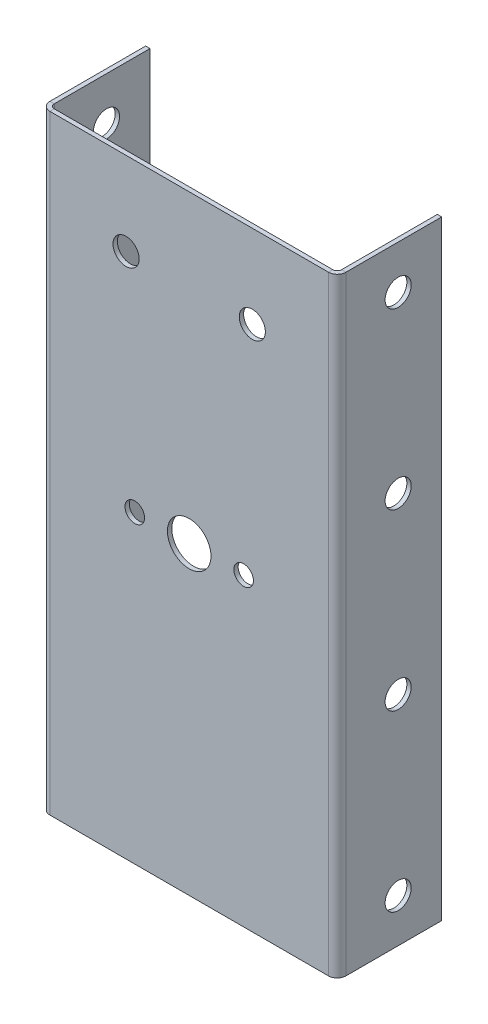
ISO-10303-21;
HEADER;
FILE_DESCRIPTION(('STEP AP214'),'2;1');
FILE_NAME('part.step','',(''),(''),'','','');
FILE_SCHEMA(('AUTOMOTIVE_DESIGN { 1 0 10303 214 1 1 1 1 }'));
ENDSEC;
DATA;
#1=APPLICATION_CONTEXT('core data for automotive mechanical design processes');
#2=APPLICATION_PROTOCOL_DEFINITION('international standard','automotive_design',2000,#1);
#3=PRODUCT_CONTEXT('',#1,'mechanical');
#4=PRODUCT('Part','Part','',(#3));
#5=PRODUCT_RELATED_PRODUCT_CATEGORY('part','',(#4));
#6=PRODUCT_DEFINITION_FORMATION('','',#4);
#7=PRODUCT_DEFINITION_CONTEXT('part definition',#1,'design');
#8=PRODUCT_DEFINITION('design','',#6,#7);
#9=PRODUCT_DEFINITION_SHAPE('','',#8);
#10=(LENGTH_UNIT() NAMED_UNIT(*) SI_UNIT(.MILLI.,.METRE.));
#11=(NAMED_UNIT(*) PLANE_ANGLE_UNIT() SI_UNIT($,.RADIAN.));
#12=(NAMED_UNIT(*) SI_UNIT($,.STERADIAN.) SOLID_ANGLE_UNIT());
#13=UNCERTAINTY_MEASURE_WITH_UNIT(LENGTH_MEASURE(1.E-05),#10,'distance_accuracy_value','');
#14=(GEOMETRIC_REPRESENTATION_CONTEXT(3) GLOBAL_UNCERTAINTY_ASSIGNED_CONTEXT((#13)) GLOBAL_UNIT_ASSIGNED_CONTEXT((#10,
#11,#12)) REPRESENTATION_CONTEXT('',''));
#15=CARTESIAN_POINT('',(0.,0.,0.));
#16=DIRECTION('',(0.,0.,1.));
#17=DIRECTION('',(1.,0.,0.));
#18=AXIS2_PLACEMENT_3D('',#15,#16,#17);
#19=CARTESIAN_POINT('',(-12.180744500846,70.,-1.));
#20=DIRECTION('',(0.,1.,0.));
#21=DIRECTION('',(0.,0.,1.));
#22=AXIS2_PLACEMENT_3D('',#19,#20,#21);
#23=PLANE('',#22);
#24=DIRECTION('',(1.,0.,0.));
#25=VECTOR('',#24,1.);
#26=CARTESIAN_POINT('',(-12.180744500846,70.,-1.));
#27=LINE('',#26,#25);
#28=CARTESIAN_POINT('',(-12.180744500846,70.,-1.));
#29=VERTEX_POINT('',#28);
#30=CARTESIAN_POINT('',(-11.680744500846,70.,-1.));
#31=VERTEX_POINT('',#30);
#32=EDGE_CURVE('E13',#29,#31,#27,.T.);
#33=ORIENTED_EDGE('',*,*,#32,.F.);
#34=CARTESIAN_POINT('',(-11.180744500846,70.,-1.));
#35=DIRECTION('',(0.,-1.,0.));
#36=DIRECTION('',(0.,0.,-1.));
#37=AXIS2_PLACEMENT_3D('',#34,#35,#36);
#38=CIRCLE('',#37,1.);
#39=CARTESIAN_POINT('',(-11.180744500846,70.,0.));
#40=VERTEX_POINT('',#39);
#41=EDGE_CURVE('E156',#29,#40,#38,.F.);
#42=ORIENTED_EDGE('',*,*,#41,.T.);
#43=DIRECTION('',(0.,0.,1.));
#44=VECTOR('',#43,1.);
#45=CARTESIAN_POINT('',(-11.180744500846,70.,-0.5));
#46=LINE('',#45,#44);
#47=CARTESIAN_POINT('',(-11.180744500846,70.,-0.5));
#48=VERTEX_POINT('',#47);
#49=EDGE_CURVE('E54',#48,#40,#46,.T.);
#50=ORIENTED_EDGE('',*,*,#49,.F.);
#51=CARTESIAN_POINT('',(-11.180744500846,70.,-1.));
#52=DIRECTION('',(0.,1.,0.));
#53=DIRECTION('',(1.,0.,0.));
#54=AXIS2_PLACEMENT_3D('',#51,#52,#53);
#55=CIRCLE('',#54,0.5);
#56=EDGE_CURVE('E251',#31,#48,#55,.T.);
#57=ORIENTED_EDGE('',*,*,#56,.F.);
#58=EDGE_LOOP('',(#33,#42,#50,#57));
#59=FACE_BOUND('',#58,.T.);
#60=ADVANCED_FACE('F46',(#59),#23,.T.);
#61=CARTESIAN_POINT('',(-11.180744500846,70.,-0.5));
#62=DIRECTION('',(0.,1.,0.));
#63=DIRECTION('',(0.,0.,1.));
#64=AXIS2_PLACEMENT_3D('',#61,#62,#63);
#65=PLANE('',#64);
#66=DIRECTION('',(0.,0.,1.));
#67=VECTOR('',#66,1.);
#68=CARTESIAN_POINT('',(-12.180744500846,70.,-12.));
#69=LINE('',#68,#67);
#70=CARTESIAN_POINT('',(-12.180744500846,70.,-12.));
#71=VERTEX_POINT('',#70);
#72=EDGE_CURVE('E161',#71,#29,#69,.T.);
#73=ORIENTED_EDGE('',*,*,#72,.T.);
#74=ORIENTED_EDGE('',*,*,#32,.T.);
#75=DIRECTION('',(0.,0.,1.));
#76=VECTOR('',#75,1.);
#77=CARTESIAN_POINT('',(-11.680744500846,70.,-12.));
#78=LINE('',#77,#76);
#79=CARTESIAN_POINT('',(-11.680744500846,70.,-12.));
#80=VERTEX_POINT('',#79);
#81=EDGE_CURVE('E264',#80,#31,#78,.T.);
#82=ORIENTED_EDGE('',*,*,#81,.F.);
#83=DIRECTION('',(1.,0.,0.));
#84=VECTOR('',#83,1.);
#85=CARTESIAN_POINT('',(-12.180744500846,70.,-12.));
#86=LINE('',#85,#84);
#87=EDGE_CURVE('E266',#71,#80,#86,.T.);
#88=ORIENTED_EDGE('',*,*,#87,.F.);
#89=EDGE_LOOP('',(#73,#74,#82,#88));
#90=FACE_BOUND('',#89,.T.);
#91=ADVANCED_FACE('F277',(#90),#65,.T.);
#92=CARTESIAN_POINT('',(-11.180744500846,0.,0.));
#93=DIRECTION('',(0.,-1.,0.));
#94=DIRECTION('',(0.,0.,-1.));
#95=AXIS2_PLACEMENT_3D('',#92,#93,#94);
#96=PLANE('',#95);
#97=DIRECTION('',(0.,0.,-1.));
#98=VECTOR('',#97,1.);
#99=CARTESIAN_POINT('',(-11.180744500846,0.,0.));
#100=LINE('',#99,#98);
#101=CARTESIAN_POINT('',(-11.180744500846,0.,0.));
#102=VERTEX_POINT('',#101);
#103=CARTESIAN_POINT('',(-11.180744500846,0.,-0.5));
#104=VERTEX_POINT('',#103);
#105=EDGE_CURVE('E154',#102,#104,#100,.T.);
#106=ORIENTED_EDGE('',*,*,#105,.F.);
#107=CARTESIAN_POINT('',(-11.180744500846,0.,-1.));
#108=DIRECTION('',(0.,-1.,0.));
#109=DIRECTION('',(0.,0.,-1.));
#110=AXIS2_PLACEMENT_3D('',#107,#108,#109);
#111=CIRCLE('',#110,1.);
#112=CARTESIAN_POINT('',(-12.180744500846,0.,-1.));
#113=VERTEX_POINT('',#112);
#114=EDGE_CURVE('E168',#113,#102,#111,.F.);
#115=ORIENTED_EDGE('',*,*,#114,.F.);
#116=DIRECTION('',(-1.,0.,0.));
#117=VECTOR('',#116,1.);
#118=CARTESIAN_POINT('',(-11.680744500846,0.,-1.));
#119=LINE('',#118,#117);
#120=CARTESIAN_POINT('',(-11.680744500846,0.,-1.));
#121=VERTEX_POINT('',#120);
#122=EDGE_CURVE('E242',#121,#113,#119,.T.);
#123=ORIENTED_EDGE('',*,*,#122,.F.);
#124=CARTESIAN_POINT('',(-11.180744500846,0.,-1.));
#125=DIRECTION('',(0.,1.,0.));
#126=DIRECTION('',(1.,0.,0.));
#127=AXIS2_PLACEMENT_3D('',#124,#125,#126);
#128=CIRCLE('',#127,0.5);
#129=EDGE_CURVE('E196',#121,#104,#128,.T.);
#130=ORIENTED_EDGE('',*,*,#129,.T.);
#131=EDGE_LOOP('',(#106,#115,#123,#130));
#132=FACE_BOUND('',#131,.T.);
#133=ADVANCED_FACE('F256',(#132),#96,.T.);
#134=CARTESIAN_POINT('',(-11.680744500846,0.,-1.));
#135=DIRECTION('',(0.,-1.,0.));
#136=DIRECTION('',(0.,0.,-1.));
#137=AXIS2_PLACEMENT_3D('',#134,#135,#136);
#138=PLANE('',#137);
#139=DIRECTION('',(1.,0.,0.));
#140=VECTOR('',#139,1.);
#141=CARTESIAN_POINT('',(-12.180744500846,0.,0.));
#142=LINE('',#141,#140);
#143=CARTESIAN_POINT('',(20.819255499154,0.,0.));
#144=VERTEX_POINT('',#143);
#145=EDGE_CURVE('E209',#102,#144,#142,.T.);
#146=ORIENTED_EDGE('',*,*,#145,.F.);
#147=ORIENTED_EDGE('',*,*,#105,.T.);
#148=DIRECTION('',(1.,0.,0.));
#149=VECTOR('',#148,1.);
#150=CARTESIAN_POINT('',(-12.180744500846,0.,-0.5));
#151=LINE('',#150,#149);
#152=CARTESIAN_POINT('',(20.819255499154,0.,-0.500000000000002));
#153=VERTEX_POINT('',#152);
#154=EDGE_CURVE('E194',#104,#153,#151,.T.);
#155=ORIENTED_EDGE('',*,*,#154,.T.);
#156=DIRECTION('',(0.,0.,1.));
#157=VECTOR('',#156,1.);
#158=CARTESIAN_POINT('',(20.819255499154,0.,-0.500000000000002));
#159=LINE('',#158,#157);
#160=EDGE_CURVE('E103',#153,#144,#159,.T.);
#161=ORIENTED_EDGE('',*,*,#160,.T.);
#162=EDGE_LOOP('',(#146,#147,#155,#161));
#163=FACE_BOUND('',#162,.T.);
#164=ADVANCED_FACE('F244',(#163),#138,.T.);
#165=CARTESIAN_POINT('',(20.819255499154,70.,0.));
#166=DIRECTION('',(0.,1.,0.));
#167=DIRECTION('',(0.,0.,1.));
#168=AXIS2_PLACEMENT_3D('',#165,#166,#167);
#169=PLANE('',#168);
#170=DIRECTION('',(0.,0.,-1.));
#171=VECTOR('',#170,1.);
#172=CARTESIAN_POINT('',(20.819255499154,70.,0.));
#173=LINE('',#172,#171);
#174=CARTESIAN_POINT('',(20.819255499154,70.,0.));
#175=VERTEX_POINT('',#174);
#176=CARTESIAN_POINT('',(20.819255499154,70.,-0.500000000000002));
#177=VERTEX_POINT('',#176);
#178=EDGE_CURVE('E240',#175,#177,#173,.T.);
#179=ORIENTED_EDGE('',*,*,#178,.F.);
#180=CARTESIAN_POINT('',(20.819255499154,70.,-1.));
#181=DIRECTION('',(0.,-1.,0.));
#182=DIRECTION('',(0.,0.,-1.));
#183=AXIS2_PLACEMENT_3D('',#180,#181,#182);
#184=CIRCLE('',#183,1.);
#185=CARTESIAN_POINT('',(21.819255499154,70.,-1.));
#186=VERTEX_POINT('',#185);
#187=EDGE_CURVE('E176',#175,#186,#184,.F.);
#188=ORIENTED_EDGE('',*,*,#187,.T.);
#189=DIRECTION('',(1.,0.,0.));
#190=VECTOR('',#189,1.);
#191=CARTESIAN_POINT('',(21.319255499154,70.,-1.));
#192=LINE('',#191,#190);
#193=CARTESIAN_POINT('',(21.319255499154,70.,-1.));
#194=VERTEX_POINT('',#193);
#195=EDGE_CURVE('E62',#194,#186,#192,.T.);
#196=ORIENTED_EDGE('',*,*,#195,.F.);
#197=CARTESIAN_POINT('',(20.819255499154,70.,-1.));
#198=DIRECTION('',(0.,1.,0.));
#199=DIRECTION('',(1.,0.,0.));
#200=AXIS2_PLACEMENT_3D('',#197,#198,#199);
#201=CIRCLE('',#200,0.5);
#202=EDGE_CURVE('E268',#177,#194,#201,.T.);
#203=ORIENTED_EDGE('',*,*,#202,.F.);
#204=EDGE_LOOP('',(#179,#188,#196,#203));
#205=FACE_BOUND('',#204,.T.);
#206=ADVANCED_FACE('F305',(#205),#169,.T.);
#207=CARTESIAN_POINT('',(21.319255499154,70.,-1.));
#208=DIRECTION('',(0.,1.,0.));
#209=DIRECTION('',(0.,0.,1.));
#210=AXIS2_PLACEMENT_3D('',#207,#208,#209);
#211=PLANE('',#210);
#212=DIRECTION('',(1.,0.,0.));
#213=VECTOR('',#212,1.);
#214=CARTESIAN_POINT('',(-12.180744500846,70.,0.));
#215=LINE('',#214,#213);
#216=EDGE_CURVE('E146',#40,#175,#215,.T.);
#217=ORIENTED_EDGE('',*,*,#216,.T.);
#218=ORIENTED_EDGE('',*,*,#178,.T.);
#219=DIRECTION('',(1.,0.,0.));
#220=VECTOR('',#219,1.);
#221=CARTESIAN_POINT('',(-12.180744500846,70.,-0.5));
#222=LINE('',#221,#220);
#223=EDGE_CURVE('E149',#48,#177,#222,.T.);
#224=ORIENTED_EDGE('',*,*,#223,.F.);
#225=ORIENTED_EDGE('',*,*,#49,.T.);
#226=EDGE_LOOP('',(#217,#218,#224,#225));
#227=FACE_BOUND('',#226,.T.);
#228=ADVANCED_FACE('F144',(#227),#211,.T.);
#229=CARTESIAN_POINT('',(21.819255499154,0.,-1.));
#230=DIRECTION('',(0.,-1.,0.));
#231=DIRECTION('',(0.,0.,-1.));
#232=AXIS2_PLACEMENT_3D('',#229,#230,#231);
#233=PLANE('',#232);
#234=DIRECTION('',(-1.,0.,0.));
#235=VECTOR('',#234,1.);
#236=CARTESIAN_POINT('',(21.819255499154,0.,-1.));
#237=LINE('',#236,#235);
#238=CARTESIAN_POINT('',(21.819255499154,0.,-1.));
#239=VERTEX_POINT('',#238);
#240=CARTESIAN_POINT('',(21.319255499154,0.,-1.));
#241=VERTEX_POINT('',#240);
#242=EDGE_CURVE('E110',#239,#241,#237,.T.);
#243=ORIENTED_EDGE('',*,*,#242,.F.);
#244=CARTESIAN_POINT('',(20.819255499154,0.,-1.));
#245=DIRECTION('',(0.,-1.,0.));
#246=DIRECTION('',(0.,0.,-1.));
#247=AXIS2_PLACEMENT_3D('',#244,#245,#246);
#248=CIRCLE('',#247,1.);
#249=EDGE_CURVE('E211',#144,#239,#248,.F.);
#250=ORIENTED_EDGE('',*,*,#249,.F.);
#251=ORIENTED_EDGE('',*,*,#160,.F.);
#252=CARTESIAN_POINT('',(20.819255499154,0.,-1.));
#253=DIRECTION('',(0.,1.,0.));
#254=DIRECTION('',(1.,0.,0.));
#255=AXIS2_PLACEMENT_3D('',#252,#253,#254);
#256=CIRCLE('',#255,0.5);
#257=EDGE_CURVE('E192',#153,#241,#256,.T.);
#258=ORIENTED_EDGE('',*,*,#257,.T.);
#259=EDGE_LOOP('',(#243,#250,#251,#258));
#260=FACE_BOUND('',#259,.T.);
#261=ADVANCED_FACE('F311',(#260),#233,.T.);
#262=CARTESIAN_POINT('',(20.819255499154,0.,-0.500000000000002));
#263=DIRECTION('',(0.,-1.,0.));
#264=DIRECTION('',(0.,0.,-1.));
#265=AXIS2_PLACEMENT_3D('',#262,#263,#264);
#266=PLANE('',#265);
#267=DIRECTION('',(0.,0.,-1.));
#268=VECTOR('',#267,1.);
#269=CARTESIAN_POINT('',(21.819255499154,0.,0.));
#270=LINE('',#269,#268);
#271=CARTESIAN_POINT('',(21.819255499154,0.,-12.));
#272=VERTEX_POINT('',#271);
#273=EDGE_CURVE('E182',#239,#272,#270,.T.);
#274=ORIENTED_EDGE('',*,*,#273,.F.);
#275=ORIENTED_EDGE('',*,*,#242,.T.);
#276=DIRECTION('',(0.,0.,-1.));
#277=VECTOR('',#276,1.);
#278=CARTESIAN_POINT('',(21.319255499154,0.,0.));
#279=LINE('',#278,#277);
#280=CARTESIAN_POINT('',(21.319255499154,0.,-12.));
#281=VERTEX_POINT('',#280);
#282=EDGE_CURVE('E189',#241,#281,#279,.T.);
#283=ORIENTED_EDGE('',*,*,#282,.T.);
#284=DIRECTION('',(1.,0.,0.));
#285=VECTOR('',#284,1.);
#286=CARTESIAN_POINT('',(21.319255499154,0.,-12.));
#287=LINE('',#286,#285);
#288=EDGE_CURVE('E185',#281,#272,#287,.T.);
#289=ORIENTED_EDGE('',*,*,#288,.T.);
#290=EDGE_LOOP('',(#274,#275,#283,#289));
#291=FACE_BOUND('',#290,.T.);
#292=ADVANCED_FACE('F314',(#291),#266,.T.);
#293=CARTESIAN_POINT('',(21.819255499154,70.,0.));
#294=DIRECTION('',(-1.,0.,0.));
#295=DIRECTION('',(0.,0.,1.));
#296=AXIS2_PLACEMENT_3D('',#293,#294,#295);
#297=PLANE('',#296);
#298=CARTESIAN_POINT('',(21.819255499154,65.,-7.));
#299=DIRECTION('',(-1.,0.,0.));
#300=DIRECTION('',(0.,0.,-1.));
#301=AXIS2_PLACEMENT_3D('',#298,#299,#300);
#302=CIRCLE('',#301,1.5);
#303=CARTESIAN_POINT('',(21.819255499154,65.,-8.5));
#304=VERTEX_POINT('',#303);
#305=EDGE_CURVE('E772',#304,#304,#302,.T.);
#306=ORIENTED_EDGE('',*,*,#305,.T.);
#307=EDGE_LOOP('',(#306));
#308=FACE_BOUND('',#307,.T.);
#309=CARTESIAN_POINT('',(21.819255499154,45.,-7.));
#310=DIRECTION('',(-1.,0.,0.));
#311=DIRECTION('',(0.,0.,-1.));
#312=AXIS2_PLACEMENT_3D('',#309,#310,#311);
#313=CIRCLE('',#312,1.5);
#314=CARTESIAN_POINT('',(21.819255499154,45.,-8.5));
#315=VERTEX_POINT('',#314);
#316=EDGE_CURVE('E760',#315,#315,#313,.T.);
#317=ORIENTED_EDGE('',*,*,#316,.T.);
#318=EDGE_LOOP('',(#317));
#319=FACE_BOUND('',#318,.T.);
#320=CARTESIAN_POINT('',(21.819255499154,5.,-7.));
#321=DIRECTION('',(-1.,0.,0.));
#322=DIRECTION('',(0.,0.,1.));
#323=AXIS2_PLACEMENT_3D('',#320,#321,#322);
#324=CIRCLE('',#323,1.5);
#325=CARTESIAN_POINT('',(21.819255499154,5.,-5.5));
#326=VERTEX_POINT('',#325);
#327=EDGE_CURVE('E748',#326,#326,#324,.T.);
#328=ORIENTED_EDGE('',*,*,#327,.T.);
#329=EDGE_LOOP('',(#328));
#330=FACE_BOUND('',#329,.T.);
#331=CARTESIAN_POINT('',(21.819255499154,25.,-7.));
#332=DIRECTION('',(-1.,0.,0.));
#333=DIRECTION('',(0.,0.,1.));
#334=AXIS2_PLACEMENT_3D('',#331,#332,#333);
#335=CIRCLE('',#334,1.5);
#336=CARTESIAN_POINT('',(21.819255499154,25.,-5.5));
#337=VERTEX_POINT('',#336);
#338=EDGE_CURVE('E736',#337,#337,#335,.T.);
#339=ORIENTED_EDGE('',*,*,#338,.T.);
#340=EDGE_LOOP('',(#339));
#341=FACE_BOUND('',#340,.T.);
#342=ORIENTED_EDGE('',*,*,#273,.T.);
#343=DIRECTION('',(0.,-1.,0.));
#344=VECTOR('',#343,1.);
#345=CARTESIAN_POINT('',(21.819255499154,70.,-12.));
#346=LINE('',#345,#344);
#347=CARTESIAN_POINT('',(21.819255499154,70.,-12.));
#348=VERTEX_POINT('',#347);
#349=EDGE_CURVE('E235',#348,#272,#346,.T.);
#350=ORIENTED_EDGE('',*,*,#349,.F.);
#351=DIRECTION('',(0.,0.,-1.));
#352=VECTOR('',#351,1.);
#353=CARTESIAN_POINT('',(21.819255499154,70.,0.));
#354=LINE('',#353,#352);
#355=EDGE_CURVE('E116',#186,#348,#354,.T.);
#356=ORIENTED_EDGE('',*,*,#355,.F.);
#357=DIRECTION('',(0.,-1.,0.));
#358=VECTOR('',#357,1.);
#359=CARTESIAN_POINT('',(21.819255499154,70.,-1.));
#360=LINE('',#359,#358);
#361=EDGE_CURVE('E178',#186,#239,#360,.T.);
#362=ORIENTED_EDGE('',*,*,#361,.T.);
#363=EDGE_LOOP('',(#342,#350,#356,#362));
#364=FACE_BOUND('',#363,.T.);
#365=ADVANCED_FACE('F317',(#308,#319,#330,#341,#364),#297,.F.);
#366=CARTESIAN_POINT('',(21.319255499154,70.,-12.));
#367=DIRECTION('',(0.,0.,-1.));
#368=DIRECTION('',(-1.,0.,0.));
#369=AXIS2_PLACEMENT_3D('',#366,#367,#368);
#370=PLANE('',#369);
#371=ORIENTED_EDGE('',*,*,#288,.F.);
#372=DIRECTION('',(0.,-1.,0.));
#373=VECTOR('',#372,1.);
#374=CARTESIAN_POINT('',(21.319255499154,70.,-12.));
#375=LINE('',#374,#373);
#376=CARTESIAN_POINT('',(21.319255499154,70.,-12.));
#377=VERTEX_POINT('',#376);
#378=EDGE_CURVE('E233',#377,#281,#375,.T.);
#379=ORIENTED_EDGE('',*,*,#378,.F.);
#380=DIRECTION('',(1.,0.,0.));
#381=VECTOR('',#380,1.);
#382=CARTESIAN_POINT('',(21.319255499154,70.,-12.));
#383=LINE('',#382,#381);
#384=EDGE_CURVE('E703',#377,#348,#383,.T.);
#385=ORIENTED_EDGE('',*,*,#384,.T.);
#386=ORIENTED_EDGE('',*,*,#349,.T.);
#387=EDGE_LOOP('',(#371,#379,#385,#386));
#388=FACE_BOUND('',#387,.T.);
#389=ADVANCED_FACE('F321',(#388),#370,.T.);
#390=CARTESIAN_POINT('',(21.319255499154,70.,0.));
#391=DIRECTION('',(-1.,0.,0.));
#392=DIRECTION('',(0.,0.,1.));
#393=AXIS2_PLACEMENT_3D('',#390,#391,#392);
#394=PLANE('',#393);
#395=CARTESIAN_POINT('',(21.319255499154,65.,-7.));
#396=DIRECTION('',(-1.,0.,0.));
#397=DIRECTION('',(0.,0.,1.));
#398=AXIS2_PLACEMENT_3D('',#395,#396,#397);
#399=CIRCLE('',#398,1.5);
#400=CARTESIAN_POINT('',(21.319255499154,65.,-5.5));
#401=VERTEX_POINT('',#400);
#402=EDGE_CURVE('E764',#401,#401,#399,.T.);
#403=ORIENTED_EDGE('',*,*,#402,.F.);
#404=EDGE_LOOP('',(#403));
#405=FACE_BOUND('',#404,.T.);
#406=CARTESIAN_POINT('',(21.319255499154,45.,-7.));
#407=DIRECTION('',(-1.,0.,0.));
#408=DIRECTION('',(0.,0.,1.));
#409=AXIS2_PLACEMENT_3D('',#406,#407,#408);
#410=CIRCLE('',#409,1.5);
#411=CARTESIAN_POINT('',(21.319255499154,45.,-5.5));
#412=VERTEX_POINT('',#411);
#413=EDGE_CURVE('E752',#412,#412,#410,.T.);
#414=ORIENTED_EDGE('',*,*,#413,.F.);
#415=EDGE_LOOP('',(#414));
#416=FACE_BOUND('',#415,.T.);
#417=CARTESIAN_POINT('',(21.319255499154,5.,-7.));
#418=DIRECTION('',(-1.,0.,0.));
#419=DIRECTION('',(0.,0.,1.));
#420=AXIS2_PLACEMENT_3D('',#417,#418,#419);
#421=CIRCLE('',#420,1.5);
#422=CARTESIAN_POINT('',(21.319255499154,5.,-5.5));
#423=VERTEX_POINT('',#422);
#424=EDGE_CURVE('E740',#423,#423,#421,.T.);
#425=ORIENTED_EDGE('',*,*,#424,.F.);
#426=EDGE_LOOP('',(#425));
#427=FACE_BOUND('',#426,.T.);
#428=CARTESIAN_POINT('',(21.319255499154,25.,-7.));
#429=DIRECTION('',(-1.,0.,0.));
#430=DIRECTION('',(0.,0.,1.));
#431=AXIS2_PLACEMENT_3D('',#428,#429,#430);
#432=CIRCLE('',#431,1.5);
#433=CARTESIAN_POINT('',(21.319255499154,25.,-5.5));
#434=VERTEX_POINT('',#433);
#435=EDGE_CURVE('E730',#434,#434,#432,.T.);
#436=ORIENTED_EDGE('',*,*,#435,.F.);
#437=EDGE_LOOP('',(#436));
#438=FACE_BOUND('',#437,.T.);
#439=ORIENTED_EDGE('',*,*,#282,.F.);
#440=DIRECTION('',(0.,-1.,0.));
#441=VECTOR('',#440,1.);
#442=CARTESIAN_POINT('',(21.319255499154,70.,-1.));
#443=LINE('',#442,#441);
#444=EDGE_CURVE('E230',#194,#241,#443,.T.);
#445=ORIENTED_EDGE('',*,*,#444,.F.);
#446=DIRECTION('',(0.,0.,-1.));
#447=VECTOR('',#446,1.);
#448=CARTESIAN_POINT('',(21.319255499154,70.,0.));
#449=LINE('',#448,#447);
#450=EDGE_CURVE('E706',#194,#377,#449,.T.);
#451=ORIENTED_EDGE('',*,*,#450,.T.);
#452=ORIENTED_EDGE('',*,*,#378,.T.);
#453=EDGE_LOOP('',(#439,#445,#451,#452));
#454=FACE_BOUND('',#453,.T.);
#455=ADVANCED_FACE('F325',(#405,#416,#427,#438,#454),#394,.T.);
#456=CARTESIAN_POINT('',(20.819255499154,70.,-1.));
#457=DIRECTION('',(0.,-1.,0.));
#458=DIRECTION('',(0.,0.,-1.));
#459=AXIS2_PLACEMENT_3D('',#456,#457,#458);
#460=CYLINDRICAL_SURFACE('',#459,0.5);
#461=ORIENTED_EDGE('',*,*,#257,.F.);
#462=DIRECTION('',(0.,-1.,0.));
#463=VECTOR('',#462,1.);
#464=CARTESIAN_POINT('',(20.819255499154,70.,-0.500000000000002));
#465=LINE('',#464,#463);
#466=EDGE_CURVE('E227',#177,#153,#465,.T.);
#467=ORIENTED_EDGE('',*,*,#466,.F.);
#468=ORIENTED_EDGE('',*,*,#202,.T.);
#469=ORIENTED_EDGE('',*,*,#444,.T.);
#470=EDGE_LOOP('',(#461,#467,#468,#469));
#471=FACE_BOUND('',#470,.T.);
#472=ADVANCED_FACE('F329',(#471),#460,.F.);
#473=CARTESIAN_POINT('',(-12.180744500846,70.,-0.5));
#474=DIRECTION('',(0.,0.,-1.));
#475=DIRECTION('',(-1.,0.,0.));
#476=AXIS2_PLACEMENT_3D('',#473,#474,#475);
#477=PLANE('',#476);
#478=CARTESIAN_POINT('',(12.069255499154,60.443372500103,-0.500000000000002));
#479=DIRECTION('',(0.,0.,-1.));
#480=DIRECTION('',(-1.,0.,0.));
#481=AXIS2_PLACEMENT_3D('',#478,#479,#480);
#482=CIRCLE('',#481,1.5);
#483=CARTESIAN_POINT('',(10.569255499154,60.443372500103,-0.500000000000002));
#484=VERTEX_POINT('',#483);
#485=EDGE_CURVE('E726',#484,#484,#482,.T.);
#486=ORIENTED_EDGE('',*,*,#485,.F.);
#487=EDGE_LOOP('',(#486));
#488=FACE_BOUND('',#487,.T.);
#489=CARTESIAN_POINT('',(-2.430744500846,60.443372500103,-0.5));
#490=DIRECTION('',(0.,0.,-1.));
#491=DIRECTION('',(-1.,0.,0.));
#492=AXIS2_PLACEMENT_3D('',#489,#490,#491);
#493=CIRCLE('',#492,1.5);
#494=CARTESIAN_POINT('',(-3.930744500846,60.443372500103,-0.5));
#495=VERTEX_POINT('',#494);
#496=EDGE_CURVE('E722',#495,#495,#493,.T.);
#497=ORIENTED_EDGE('',*,*,#496,.F.);
#498=EDGE_LOOP('',(#497));
#499=FACE_BOUND('',#498,.T.);
#500=CARTESIAN_POINT('',(11.069255499154,35.,-0.500000000000002));
#501=DIRECTION('',(0.,0.,-1.));
#502=DIRECTION('',(-1.,0.,0.));
#503=AXIS2_PLACEMENT_3D('',#500,#501,#502);
#504=CIRCLE('',#503,1.125);
#505=CARTESIAN_POINT('',(9.944255499154,35.,-0.500000000000002));
#506=VERTEX_POINT('',#505);
#507=EDGE_CURVE('E718',#506,#506,#504,.T.);
#508=ORIENTED_EDGE('',*,*,#507,.F.);
#509=EDGE_LOOP('',(#508));
#510=FACE_BOUND('',#509,.T.);
#511=CARTESIAN_POINT('',(-1.430744500846,35.,-0.5));
#512=DIRECTION('',(0.,0.,-1.));
#513=DIRECTION('',(-1.,0.,0.));
#514=AXIS2_PLACEMENT_3D('',#511,#512,#513);
#515=CIRCLE('',#514,1.125);
#516=CARTESIAN_POINT('',(-2.555744500846,35.,-0.5));
#517=VERTEX_POINT('',#516);
#518=EDGE_CURVE('E694',#517,#517,#515,.T.);
#519=ORIENTED_EDGE('',*,*,#518,.F.);
#520=EDGE_LOOP('',(#519));
#521=FACE_BOUND('',#520,.T.);
#522=CARTESIAN_POINT('',(4.819255499154,35.,-0.500000000000002));
#523=DIRECTION('',(0.,0.,-1.));
#524=DIRECTION('',(-1.,0.,0.));
#525=AXIS2_PLACEMENT_3D('',#522,#523,#524);
#526=CIRCLE('',#525,2.5);
#527=CARTESIAN_POINT('',(2.319255499154,35.,-0.500000000000002));
#528=VERTEX_POINT('',#527);
#529=EDGE_CURVE('E186',#528,#528,#526,.T.);
#530=ORIENTED_EDGE('',*,*,#529,.F.);
#531=EDGE_LOOP('',(#530));
#532=FACE_BOUND('',#531,.T.);
#533=ORIENTED_EDGE('',*,*,#154,.F.);
#534=DIRECTION('',(0.,-1.,0.));
#535=VECTOR('',#534,1.);
#536=CARTESIAN_POINT('',(-11.180744500846,70.,-0.5));
#537=LINE('',#536,#535);
#538=EDGE_CURVE('E224',#48,#104,#537,.T.);
#539=ORIENTED_EDGE('',*,*,#538,.F.);
#540=ORIENTED_EDGE('',*,*,#223,.T.);
#541=ORIENTED_EDGE('',*,*,#466,.T.);
#542=EDGE_LOOP('',(#533,#539,#540,#541));
#543=FACE_BOUND('',#542,.T.);
#544=ADVANCED_FACE('F253',(#488,#499,#510,#521,#532,#543),#477,.T.);
#545=CARTESIAN_POINT('',(-11.180744500846,70.,-1.));
#546=DIRECTION('',(0.,-1.,0.));
#547=DIRECTION('',(0.,0.,-1.));
#548=AXIS2_PLACEMENT_3D('',#545,#546,#547);
#549=CYLINDRICAL_SURFACE('',#548,0.5);
#550=ORIENTED_EDGE('',*,*,#129,.F.);
#551=DIRECTION('',(0.,-1.,0.));
#552=VECTOR('',#551,1.);
#553=CARTESIAN_POINT('',(-11.680744500846,70.,-1.));
#554=LINE('',#553,#552);
#555=EDGE_CURVE('E221',#31,#121,#554,.T.);
#556=ORIENTED_EDGE('',*,*,#555,.F.);
#557=ORIENTED_EDGE('',*,*,#56,.T.);
#558=ORIENTED_EDGE('',*,*,#538,.T.);
#559=EDGE_LOOP('',(#550,#556,#557,#558));
#560=FACE_BOUND('',#559,.T.);
#561=ADVANCED_FACE('F249',(#560),#549,.F.);
#562=CARTESIAN_POINT('',(-11.680744500846,70.,-12.));
#563=DIRECTION('',(1.,0.,0.));
#564=DIRECTION('',(0.,0.,-1.));
#565=AXIS2_PLACEMENT_3D('',#562,#563,#564);
#566=PLANE('',#565);
#567=CARTESIAN_POINT('',(-11.680744500846,65.,-6.99999999999999));
#568=DIRECTION('',(1.,0.,0.));
#569=DIRECTION('',(0.,0.,-1.));
#570=AXIS2_PLACEMENT_3D('',#567,#568,#569);
#571=CIRCLE('',#570,1.5);
#572=CARTESIAN_POINT('',(-11.680744500846,65.,-8.49999999999999));
#573=VERTEX_POINT('',#572);
#574=EDGE_CURVE('E769',#573,#573,#571,.T.);
#575=ORIENTED_EDGE('',*,*,#574,.F.);
#576=EDGE_LOOP('',(#575));
#577=FACE_BOUND('',#576,.T.);
#578=CARTESIAN_POINT('',(-11.680744500846,45.,-6.99999999999999));
#579=DIRECTION('',(1.,0.,0.));
#580=DIRECTION('',(0.,0.,-1.));
#581=AXIS2_PLACEMENT_3D('',#578,#579,#580);
#582=CIRCLE('',#581,1.5);
#583=CARTESIAN_POINT('',(-11.680744500846,45.,-8.49999999999999));
#584=VERTEX_POINT('',#583);
#585=EDGE_CURVE('E757',#584,#584,#582,.T.);
#586=ORIENTED_EDGE('',*,*,#585,.F.);
#587=EDGE_LOOP('',(#586));
#588=FACE_BOUND('',#587,.T.);
#589=CARTESIAN_POINT('',(-11.680744500846,5.,-6.99999999999999));
#590=DIRECTION('',(1.,0.,0.));
#591=DIRECTION('',(0.,0.,-1.));
#592=AXIS2_PLACEMENT_3D('',#589,#590,#591);
#593=CIRCLE('',#592,1.5);
#594=CARTESIAN_POINT('',(-11.680744500846,5.,-8.49999999999999));
#595=VERTEX_POINT('',#594);
#596=EDGE_CURVE('E745',#595,#595,#593,.T.);
#597=ORIENTED_EDGE('',*,*,#596,.F.);
#598=EDGE_LOOP('',(#597));
#599=FACE_BOUND('',#598,.T.);
#600=CARTESIAN_POINT('',(-11.680744500846,25.,-6.99999999999999));
#601=DIRECTION('',(1.,0.,0.));
#602=DIRECTION('',(0.,0.,-1.));
#603=AXIS2_PLACEMENT_3D('',#600,#601,#602);
#604=CIRCLE('',#603,1.5);
#605=CARTESIAN_POINT('',(-11.680744500846,25.,-8.49999999999999));
#606=VERTEX_POINT('',#605);
#607=EDGE_CURVE('E733',#606,#606,#604,.T.);
#608=ORIENTED_EDGE('',*,*,#607,.F.);
#609=EDGE_LOOP('',(#608));
#610=FACE_BOUND('',#609,.T.);
#611=DIRECTION('',(0.,0.,1.));
#612=VECTOR('',#611,1.);
#613=CARTESIAN_POINT('',(-11.680744500846,0.,-12.));
#614=LINE('',#613,#612);
#615=CARTESIAN_POINT('',(-11.680744500846,0.,-12.));
#616=VERTEX_POINT('',#615);
#617=EDGE_CURVE('E199',#616,#121,#614,.T.);
#618=ORIENTED_EDGE('',*,*,#617,.F.);
#619=DIRECTION('',(0.,-1.,0.));
#620=VECTOR('',#619,1.);
#621=CARTESIAN_POINT('',(-11.680744500846,70.,-12.));
#622=LINE('',#621,#620);
#623=EDGE_CURVE('E219',#80,#616,#622,.T.);
#624=ORIENTED_EDGE('',*,*,#623,.F.);
#625=ORIENTED_EDGE('',*,*,#81,.T.);
#626=ORIENTED_EDGE('',*,*,#555,.T.);
#627=EDGE_LOOP('',(#618,#624,#625,#626));
#628=FACE_BOUND('',#627,.T.);
#629=ADVANCED_FACE('F262',(#577,#588,#599,#610,#628),#566,.T.);
#630=CARTESIAN_POINT('',(-12.180744500846,70.,-12.));
#631=DIRECTION('',(0.,0.,-1.));
#632=DIRECTION('',(-1.,0.,0.));
#633=AXIS2_PLACEMENT_3D('',#630,#631,#632);
#634=PLANE('',#633);
#635=DIRECTION('',(1.,0.,0.));
#636=VECTOR('',#635,1.);
#637=CARTESIAN_POINT('',(-12.180744500846,0.,-12.));
#638=LINE('',#637,#636);
#639=CARTESIAN_POINT('',(-12.180744500846,0.,-12.));
#640=VERTEX_POINT('',#639);
#641=EDGE_CURVE('E202',#640,#616,#638,.T.);
#642=ORIENTED_EDGE('',*,*,#641,.F.);
#643=DIRECTION('',(0.,-1.,0.));
#644=VECTOR('',#643,1.);
#645=CARTESIAN_POINT('',(-12.180744500846,70.,-12.));
#646=LINE('',#645,#644);
#647=EDGE_CURVE('E217',#71,#640,#646,.T.);
#648=ORIENTED_EDGE('',*,*,#647,.F.);
#649=ORIENTED_EDGE('',*,*,#87,.T.);
#650=ORIENTED_EDGE('',*,*,#623,.T.);
#651=EDGE_LOOP('',(#642,#648,#649,#650));
#652=FACE_BOUND('',#651,.T.);
#653=ADVANCED_FACE('F283',(#652),#634,.T.);
#654=CARTESIAN_POINT('',(-12.180744500846,70.,-12.));
#655=DIRECTION('',(1.,0.,0.));
#656=DIRECTION('',(0.,0.,-1.));
#657=AXIS2_PLACEMENT_3D('',#654,#655,#656);
#658=PLANE('',#657);
#659=CARTESIAN_POINT('',(-12.180744500846,65.,-6.99999999999999));
#660=DIRECTION('',(-1.,0.,0.));
#661=DIRECTION('',(0.,0.,-1.));
#662=AXIS2_PLACEMENT_3D('',#659,#660,#661);
#663=CIRCLE('',#662,1.5);
#664=CARTESIAN_POINT('',(-12.180744500846,65.,-8.49999999999999));
#665=VERTEX_POINT('',#664);
#666=EDGE_CURVE('E773',#665,#665,#663,.T.);
#667=ORIENTED_EDGE('',*,*,#666,.F.);
#668=EDGE_LOOP('',(#667));
#669=FACE_BOUND('',#668,.T.);
#670=CARTESIAN_POINT('',(-12.180744500846,45.,-6.99999999999999));
#671=DIRECTION('',(-1.,0.,0.));
#672=DIRECTION('',(0.,0.,-1.));
#673=AXIS2_PLACEMENT_3D('',#670,#671,#672);
#674=CIRCLE('',#673,1.5);
#675=CARTESIAN_POINT('',(-12.180744500846,45.,-8.49999999999999));
#676=VERTEX_POINT('',#675);
#677=EDGE_CURVE('E761',#676,#676,#674,.T.);
#678=ORIENTED_EDGE('',*,*,#677,.F.);
#679=EDGE_LOOP('',(#678));
#680=FACE_BOUND('',#679,.T.);
#681=CARTESIAN_POINT('',(-12.180744500846,5.,-6.99999999999999));
#682=DIRECTION('',(-1.,0.,0.));
#683=DIRECTION('',(0.,0.,1.));
#684=AXIS2_PLACEMENT_3D('',#681,#682,#683);
#685=CIRCLE('',#684,1.5);
#686=CARTESIAN_POINT('',(-12.180744500846,5.,-5.49999999999999));
#687=VERTEX_POINT('',#686);
#688=EDGE_CURVE('E749',#687,#687,#685,.T.);
#689=ORIENTED_EDGE('',*,*,#688,.F.);
#690=EDGE_LOOP('',(#689));
#691=FACE_BOUND('',#690,.T.);
#692=CARTESIAN_POINT('',(-12.180744500846,25.,-6.99999999999999));
#693=DIRECTION('',(-1.,0.,0.));
#694=DIRECTION('',(0.,0.,1.));
#695=AXIS2_PLACEMENT_3D('',#692,#693,#694);
#696=CIRCLE('',#695,1.5);
#697=CARTESIAN_POINT('',(-12.180744500846,25.,-5.49999999999999));
#698=VERTEX_POINT('',#697);
#699=EDGE_CURVE('E737',#698,#698,#696,.T.);
#700=ORIENTED_EDGE('',*,*,#699,.F.);
#701=EDGE_LOOP('',(#700));
#702=FACE_BOUND('',#701,.T.);
#703=DIRECTION('',(0.,0.,1.));
#704=VECTOR('',#703,1.);
#705=CARTESIAN_POINT('',(-12.180744500846,0.,-12.));
#706=LINE('',#705,#704);
#707=EDGE_CURVE('E205',#640,#113,#706,.T.);
#708=ORIENTED_EDGE('',*,*,#707,.T.);
#709=DIRECTION('',(0.,-1.,0.));
#710=VECTOR('',#709,1.);
#711=CARTESIAN_POINT('',(-12.180744500846,70.,-1.));
#712=LINE('',#711,#710);
#713=EDGE_CURVE('E170',#29,#113,#712,.T.);
#714=ORIENTED_EDGE('',*,*,#713,.F.);
#715=ORIENTED_EDGE('',*,*,#72,.F.);
#716=ORIENTED_EDGE('',*,*,#647,.T.);
#717=EDGE_LOOP('',(#708,#714,#715,#716));
#718=FACE_BOUND('',#717,.T.);
#719=ADVANCED_FACE('F279',(#669,#680,#691,#702,#718),#658,.F.);
#720=CARTESIAN_POINT('',(-11.180744500846,70.,-1.));
#721=DIRECTION('',(0.,-1.,0.));
#722=DIRECTION('',(0.,0.,-1.));
#723=AXIS2_PLACEMENT_3D('',#720,#721,#722);
#724=CYLINDRICAL_SURFACE('',#723,1.);
#725=ORIENTED_EDGE('',*,*,#114,.T.);
#726=DIRECTION('',(0.,-1.,0.));
#727=VECTOR('',#726,1.);
#728=CARTESIAN_POINT('',(-11.180744500846,70.,0.));
#729=LINE('',#728,#727);
#730=EDGE_CURVE('E165',#40,#102,#729,.T.);
#731=ORIENTED_EDGE('',*,*,#730,.F.);
#732=ORIENTED_EDGE('',*,*,#41,.F.);
#733=ORIENTED_EDGE('',*,*,#713,.T.);
#734=EDGE_LOOP('',(#725,#731,#732,#733));
#735=FACE_BOUND('',#734,.T.);
#736=ADVANCED_FACE('F166',(#735),#724,.T.);
#737=CARTESIAN_POINT('',(-12.180744500846,70.,0.));
#738=DIRECTION('',(0.,0.,-1.));
#739=DIRECTION('',(-1.,0.,0.));
#740=AXIS2_PLACEMENT_3D('',#737,#738,#739);
#741=PLANE('',#740);
#742=CARTESIAN_POINT('',(12.069255499154,60.443372500103,0.));
#743=DIRECTION('',(0.,0.,1.));
#744=DIRECTION('',(-1.,0.,0.));
#745=AXIS2_PLACEMENT_3D('',#742,#743,#744);
#746=CIRCLE('',#745,1.5);
#747=CARTESIAN_POINT('',(10.569255499154,60.443372500103,0.));
#748=VERTEX_POINT('',#747);
#749=EDGE_CURVE('E677',#748,#748,#746,.T.);
#750=ORIENTED_EDGE('',*,*,#749,.F.);
#751=EDGE_LOOP('',(#750));
#752=FACE_BOUND('',#751,.T.);
#753=CARTESIAN_POINT('',(-2.430744500846,60.443372500103,0.));
#754=DIRECTION('',(0.,0.,1.));
#755=DIRECTION('',(1.,0.,0.));
#756=AXIS2_PLACEMENT_3D('',#753,#754,#755);
#757=CIRCLE('',#756,1.5);
#758=CARTESIAN_POINT('',(-0.930744500845995,60.443372500103,0.));
#759=VERTEX_POINT('',#758);
#760=EDGE_CURVE('E681',#759,#759,#757,.T.);
#761=ORIENTED_EDGE('',*,*,#760,.F.);
#762=EDGE_LOOP('',(#761));
#763=FACE_BOUND('',#762,.T.);
#764=CARTESIAN_POINT('',(11.069255499154,35.,0.));
#765=DIRECTION('',(0.,0.,1.));
#766=DIRECTION('',(-1.,0.,0.));
#767=AXIS2_PLACEMENT_3D('',#764,#765,#766);
#768=CIRCLE('',#767,1.125);
#769=CARTESIAN_POINT('',(9.944255499154,35.,0.));
#770=VERTEX_POINT('',#769);
#771=EDGE_CURVE('E685',#770,#770,#768,.T.);
#772=ORIENTED_EDGE('',*,*,#771,.F.);
#773=EDGE_LOOP('',(#772));
#774=FACE_BOUND('',#773,.T.);
#775=CARTESIAN_POINT('',(-1.430744500846,35.,0.));
#776=DIRECTION('',(0.,0.,1.));
#777=DIRECTION('',(1.,0.,0.));
#778=AXIS2_PLACEMENT_3D('',#775,#776,#777);
#779=CIRCLE('',#778,1.125);
#780=CARTESIAN_POINT('',(-0.305744500845995,35.,0.));
#781=VERTEX_POINT('',#780);
#782=EDGE_CURVE('E689',#781,#781,#779,.T.);
#783=ORIENTED_EDGE('',*,*,#782,.F.);
#784=EDGE_LOOP('',(#783));
#785=FACE_BOUND('',#784,.T.);
#786=CARTESIAN_POINT('',(4.819255499154,35.,0.));
#787=DIRECTION('',(0.,0.,1.));
#788=DIRECTION('',(1.,0.,0.));
#789=AXIS2_PLACEMENT_3D('',#786,#787,#788);
#790=CIRCLE('',#789,2.5);
#791=CARTESIAN_POINT('',(7.31925549915401,35.,0.));
#792=VERTEX_POINT('',#791);
#793=EDGE_CURVE('E692',#792,#792,#790,.T.);
#794=ORIENTED_EDGE('',*,*,#793,.F.);
#795=EDGE_LOOP('',(#794));
#796=FACE_BOUND('',#795,.T.);
#797=ORIENTED_EDGE('',*,*,#145,.T.);
#798=DIRECTION('',(0.,-1.,0.));
#799=VECTOR('',#798,1.);
#800=CARTESIAN_POINT('',(20.819255499154,70.,0.));
#801=LINE('',#800,#799);
#802=EDGE_CURVE('E171',#175,#144,#801,.T.);
#803=ORIENTED_EDGE('',*,*,#802,.F.);
#804=ORIENTED_EDGE('',*,*,#216,.F.);
#805=ORIENTED_EDGE('',*,*,#730,.T.);
#806=EDGE_LOOP('',(#797,#803,#804,#805));
#807=FACE_BOUND('',#806,.T.);
#808=ADVANCED_FACE('F173',(#752,#763,#774,#785,#796,#807),#741,.F.);
#809=CARTESIAN_POINT('',(20.819255499154,70.,-1.));
#810=DIRECTION('',(0.,-1.,0.));
#811=DIRECTION('',(0.,0.,-1.));
#812=AXIS2_PLACEMENT_3D('',#809,#810,#811);
#813=CYLINDRICAL_SURFACE('',#812,1.);
#814=ORIENTED_EDGE('',*,*,#249,.T.);
#815=ORIENTED_EDGE('',*,*,#361,.F.);
#816=ORIENTED_EDGE('',*,*,#187,.F.);
#817=ORIENTED_EDGE('',*,*,#802,.T.);
#818=EDGE_LOOP('',(#814,#815,#816,#817));
#819=FACE_BOUND('',#818,.T.);
#820=ADVANCED_FACE('F554',(#819),#813,.T.);
#821=CARTESIAN_POINT('',(20.819255499154,70.,-1.));
#822=DIRECTION('',(0.,1.,0.));
#823=DIRECTION('',(1.,0.,0.));
#824=AXIS2_PLACEMENT_3D('',#821,#822,#823);
#825=PLANE('',#824);
#826=ORIENTED_EDGE('',*,*,#355,.T.);
#827=ORIENTED_EDGE('',*,*,#384,.F.);
#828=ORIENTED_EDGE('',*,*,#450,.F.);
#829=ORIENTED_EDGE('',*,*,#195,.T.);
#830=EDGE_LOOP('',(#826,#827,#828,#829));
#831=FACE_BOUND('',#830,.T.);
#832=ADVANCED_FACE('F559',(#831),#825,.T.);
#833=CARTESIAN_POINT('',(20.819255499154,0.,-1.));
#834=DIRECTION('',(0.,1.,0.));
#835=DIRECTION('',(1.,0.,0.));
#836=AXIS2_PLACEMENT_3D('',#833,#834,#835);
#837=PLANE('',#836);
#838=ORIENTED_EDGE('',*,*,#617,.T.);
#839=ORIENTED_EDGE('',*,*,#122,.T.);
#840=ORIENTED_EDGE('',*,*,#707,.F.);
#841=ORIENTED_EDGE('',*,*,#641,.T.);
#842=EDGE_LOOP('',(#838,#839,#840,#841));
#843=FACE_BOUND('',#842,.T.);
#844=ADVANCED_FACE('F281',(#843),#837,.F.);
#845=CARTESIAN_POINT('',(4.819255499154,35.,-10.));
#846=DIRECTION('',(0.,0.,1.));
#847=DIRECTION('',(1.,0.,0.));
#848=AXIS2_PLACEMENT_3D('',#845,#846,#847);
#849=CYLINDRICAL_SURFACE('',#848,2.5);
#850=ORIENTED_EDGE('',*,*,#529,.T.);
#851=EDGE_LOOP('',(#850));
#852=FACE_BOUND('',#851,.T.);
#853=ORIENTED_EDGE('',*,*,#793,.T.);
#854=EDGE_LOOP('',(#853));
#855=FACE_BOUND('',#854,.T.);
#856=ADVANCED_FACE('F494',(#852,#855),#849,.F.);
#857=CARTESIAN_POINT('',(-1.430744500846,35.,-10.));
#858=DIRECTION('',(0.,0.,1.));
#859=DIRECTION('',(1.,0.,0.));
#860=AXIS2_PLACEMENT_3D('',#857,#858,#859);
#861=CYLINDRICAL_SURFACE('',#860,1.125);
#862=ORIENTED_EDGE('',*,*,#518,.T.);
#863=EDGE_LOOP('',(#862));
#864=FACE_BOUND('',#863,.T.);
#865=ORIENTED_EDGE('',*,*,#782,.T.);
#866=EDGE_LOOP('',(#865));
#867=FACE_BOUND('',#866,.T.);
#868=ADVANCED_FACE('F484',(#864,#867),#861,.F.);
#869=CARTESIAN_POINT('',(11.069255499154,35.,-10.));
#870=DIRECTION('',(0.,0.,1.));
#871=DIRECTION('',(1.,0.,0.));
#872=AXIS2_PLACEMENT_3D('',#869,#870,#871);
#873=CYLINDRICAL_SURFACE('',#872,1.125);
#874=ORIENTED_EDGE('',*,*,#507,.T.);
#875=EDGE_LOOP('',(#874));
#876=FACE_BOUND('',#875,.T.);
#877=ORIENTED_EDGE('',*,*,#771,.T.);
#878=EDGE_LOOP('',(#877));
#879=FACE_BOUND('',#878,.T.);
#880=ADVANCED_FACE('F474',(#876,#879),#873,.F.);
#881=CARTESIAN_POINT('',(-2.430744500846,60.443372500103,-10.));
#882=DIRECTION('',(0.,0.,1.));
#883=DIRECTION('',(1.,0.,0.));
#884=AXIS2_PLACEMENT_3D('',#881,#882,#883);
#885=CYLINDRICAL_SURFACE('',#884,1.5);
#886=ORIENTED_EDGE('',*,*,#496,.T.);
#887=EDGE_LOOP('',(#886));
#888=FACE_BOUND('',#887,.T.);
#889=ORIENTED_EDGE('',*,*,#760,.T.);
#890=EDGE_LOOP('',(#889));
#891=FACE_BOUND('',#890,.T.);
#892=ADVANCED_FACE('F464',(#888,#891),#885,.F.);
#893=CARTESIAN_POINT('',(12.069255499154,60.443372500103,-10.));
#894=DIRECTION('',(0.,0.,1.));
#895=DIRECTION('',(1.,0.,0.));
#896=AXIS2_PLACEMENT_3D('',#893,#894,#895);
#897=CYLINDRICAL_SURFACE('',#896,1.5);
#898=ORIENTED_EDGE('',*,*,#485,.T.);
#899=EDGE_LOOP('',(#898));
#900=FACE_BOUND('',#899,.T.);
#901=ORIENTED_EDGE('',*,*,#749,.T.);
#902=EDGE_LOOP('',(#901));
#903=FACE_BOUND('',#902,.T.);
#904=ADVANCED_FACE('F373',(#900,#903),#897,.F.);
#905=CARTESIAN_POINT('',(21.819255499154,25.,-7.));
#906=DIRECTION('',(-1.,0.,0.));
#907=DIRECTION('',(0.,0.,1.));
#908=AXIS2_PLACEMENT_3D('',#905,#906,#907);
#909=CYLINDRICAL_SURFACE('',#908,1.5);
#910=ORIENTED_EDGE('',*,*,#607,.T.);
#911=EDGE_LOOP('',(#910));
#912=FACE_BOUND('',#911,.T.);
#913=ORIENTED_EDGE('',*,*,#699,.T.);
#914=EDGE_LOOP('',(#913));
#915=FACE_BOUND('',#914,.T.);
#916=ADVANCED_FACE('F367',(#912,#915),#909,.F.);
#917=ORIENTED_EDGE('',*,*,#435,.T.);
#918=EDGE_LOOP('',(#917));
#919=FACE_BOUND('',#918,.T.);
#920=ORIENTED_EDGE('',*,*,#338,.F.);
#921=EDGE_LOOP('',(#920));
#922=FACE_BOUND('',#921,.T.);
#923=ADVANCED_FACE('F372',(#919,#922),#909,.F.);
#924=CARTESIAN_POINT('',(21.819255499154,5.,-7.));
#925=DIRECTION('',(-1.,0.,0.));
#926=DIRECTION('',(0.,0.,1.));
#927=AXIS2_PLACEMENT_3D('',#924,#925,#926);
#928=CYLINDRICAL_SURFACE('',#927,1.5);
#929=ORIENTED_EDGE('',*,*,#596,.T.);
#930=EDGE_LOOP('',(#929));
#931=FACE_BOUND('',#930,.T.);
#932=ORIENTED_EDGE('',*,*,#688,.T.);
#933=EDGE_LOOP('',(#932));
#934=FACE_BOUND('',#933,.T.);
#935=ADVANCED_FACE('F386',(#931,#934),#928,.F.);
#936=ORIENTED_EDGE('',*,*,#424,.T.);
#937=EDGE_LOOP('',(#936));
#938=FACE_BOUND('',#937,.T.);
#939=ORIENTED_EDGE('',*,*,#327,.F.);
#940=EDGE_LOOP('',(#939));
#941=FACE_BOUND('',#940,.T.);
#942=ADVANCED_FACE('F396',(#938,#941),#928,.F.);
#943=CARTESIAN_POINT('',(21.819255499154,45.,-7.));
#944=DIRECTION('',(-1.,0.,0.));
#945=DIRECTION('',(0.,0.,1.));
#946=AXIS2_PLACEMENT_3D('',#943,#944,#945);
#947=CYLINDRICAL_SURFACE('',#946,1.5);
#948=ORIENTED_EDGE('',*,*,#585,.T.);
#949=EDGE_LOOP('',(#948));
#950=FACE_BOUND('',#949,.T.);
#951=ORIENTED_EDGE('',*,*,#677,.T.);
#952=EDGE_LOOP('',(#951));
#953=FACE_BOUND('',#952,.T.);
#954=ADVANCED_FACE('F407',(#950,#953),#947,.F.);
#955=ORIENTED_EDGE('',*,*,#413,.T.);
#956=EDGE_LOOP('',(#955));
#957=FACE_BOUND('',#956,.T.);
#958=ORIENTED_EDGE('',*,*,#316,.F.);
#959=EDGE_LOOP('',(#958));
#960=FACE_BOUND('',#959,.T.);
#961=ADVANCED_FACE('F417',(#957,#960),#947,.F.);
#962=CARTESIAN_POINT('',(21.819255499154,65.,-7.));
#963=DIRECTION('',(-1.,0.,0.));
#964=DIRECTION('',(0.,0.,1.));
#965=AXIS2_PLACEMENT_3D('',#962,#963,#964);
#966=CYLINDRICAL_SURFACE('',#965,1.5);
#967=ORIENTED_EDGE('',*,*,#574,.T.);
#968=EDGE_LOOP('',(#967));
#969=FACE_BOUND('',#968,.T.);
#970=ORIENTED_EDGE('',*,*,#666,.T.);
#971=EDGE_LOOP('',(#970));
#972=FACE_BOUND('',#971,.T.);
#973=ADVANCED_FACE('F428',(#969,#972),#966,.F.);
#974=ORIENTED_EDGE('',*,*,#402,.T.);
#975=EDGE_LOOP('',(#974));
#976=FACE_BOUND('',#975,.T.);
#977=ORIENTED_EDGE('',*,*,#305,.F.);
#978=EDGE_LOOP('',(#977));
#979=FACE_BOUND('',#978,.T.);
#980=ADVANCED_FACE('F438',(#976,#979),#966,.F.);
#981=CLOSED_SHELL('',(#60,#91,#133,#164,#206,#228,#261,#292,#365,#389,#455,#472,#544,#561,#629,
#653,#719,#736,#808,#820,#832,#844,#856,#868,#880,#892,#904,#916,#923,#935,#942,#954,#961,#973,#980));
#982=MANIFOLD_SOLID_BREP('B2',#981);
#983=ADVANCED_BREP_SHAPE_REPRESENTATION('',(#18,#982),#14);
#984=SHAPE_DEFINITION_REPRESENTATION(#9,#983);
ENDSEC;
END-ISO-10303-21;
